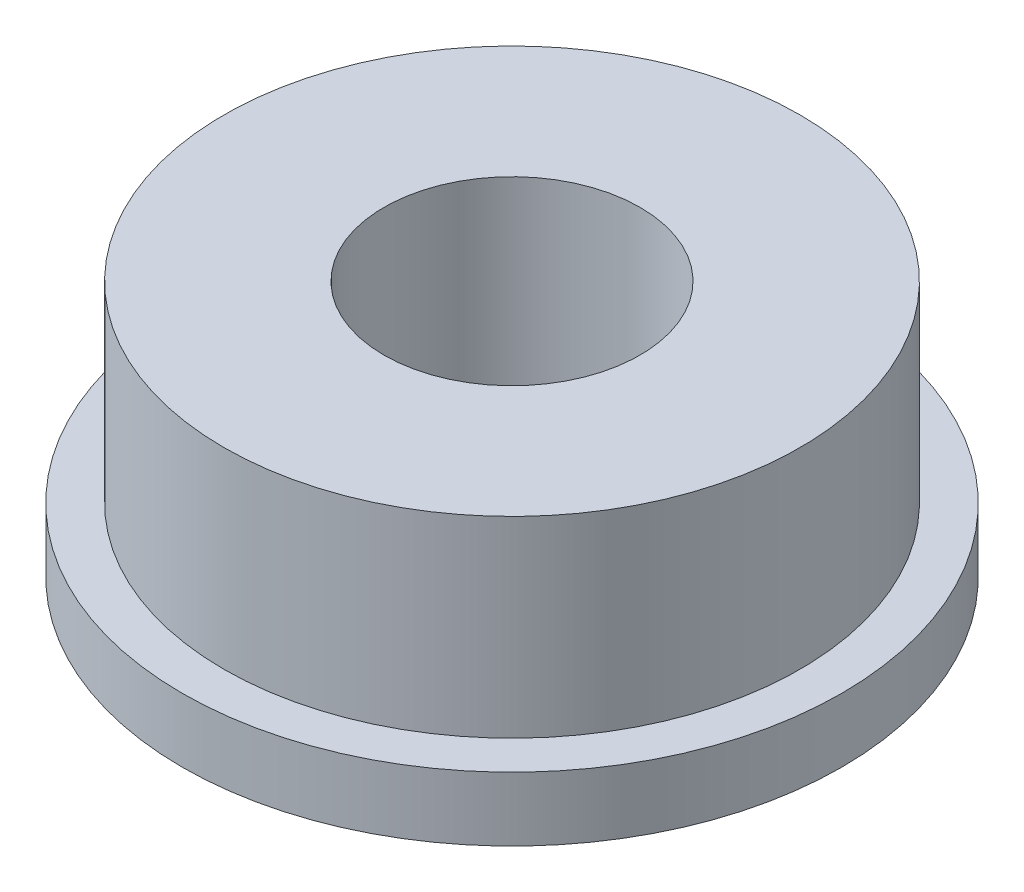
ISO-10303-21;
HEADER;
FILE_DESCRIPTION(('STEP AP214'),'2;1');
FILE_NAME('part.step','',(''),(''),'','','');
FILE_SCHEMA(('AUTOMOTIVE_DESIGN { 1 0 10303 214 1 1 1 1 }'));
ENDSEC;
DATA;
#1=APPLICATION_CONTEXT('core data for automotive mechanical design processes');
#2=APPLICATION_PROTOCOL_DEFINITION('international standard','automotive_design',2000,#1);
#3=PRODUCT_CONTEXT('',#1,'mechanical');
#4=PRODUCT('Part','Part','',(#3));
#5=PRODUCT_RELATED_PRODUCT_CATEGORY('part','',(#4));
#6=PRODUCT_DEFINITION_FORMATION('','',#4);
#7=PRODUCT_DEFINITION_CONTEXT('part definition',#1,'design');
#8=PRODUCT_DEFINITION('design','',#6,#7);
#9=PRODUCT_DEFINITION_SHAPE('','',#8);
#10=(LENGTH_UNIT() NAMED_UNIT(*) SI_UNIT(.MILLI.,.METRE.));
#11=(NAMED_UNIT(*) PLANE_ANGLE_UNIT() SI_UNIT($,.RADIAN.));
#12=(NAMED_UNIT(*) SI_UNIT($,.STERADIAN.) SOLID_ANGLE_UNIT());
#13=UNCERTAINTY_MEASURE_WITH_UNIT(LENGTH_MEASURE(1.E-05),#10,'distance_accuracy_value','');
#14=(GEOMETRIC_REPRESENTATION_CONTEXT(3) GLOBAL_UNCERTAINTY_ASSIGNED_CONTEXT((#13)) GLOBAL_UNIT_ASSIGNED_CONTEXT((#10,
#11,#12)) REPRESENTATION_CONTEXT('',''));
#15=CARTESIAN_POINT('',(0.,0.,0.));
#16=DIRECTION('',(0.,0.,1.));
#17=DIRECTION('',(1.,0.,0.));
#18=AXIS2_PLACEMENT_3D('',#15,#16,#17);
#19=CARTESIAN_POINT('',(0.,1.,0.));
#20=DIRECTION('',(0.,1.,0.));
#21=DIRECTION('',(0.,0.,-1.));
#22=AXIS2_PLACEMENT_3D('',#19,#20,#21);
#23=PLANE('',#22);
#24=CARTESIAN_POINT('',(0.,1.,0.));
#25=DIRECTION('',(0.,-1.,0.));
#26=DIRECTION('',(0.,0.,-1.));
#27=AXIS2_PLACEMENT_3D('',#24,#25,#26);
#28=CIRCLE('',#27,5.15);
#29=CARTESIAN_POINT('',(0.,1.,-5.15));
#30=VERTEX_POINT('',#29);
#31=EDGE_CURVE('E10',#30,#30,#28,.T.);
#32=ORIENTED_EDGE('',*,*,#31,.F.);
#33=EDGE_LOOP('',(#32));
#34=FACE_BOUND('',#33,.T.);
#35=CARTESIAN_POINT('',(0.,1.,0.));
#36=DIRECTION('',(0.,-1.,0.));
#37=DIRECTION('',(0.,0.,-1.));
#38=AXIS2_PLACEMENT_3D('',#35,#36,#37);
#39=CIRCLE('',#38,4.5);
#40=CARTESIAN_POINT('',(0.,1.,-4.5));
#41=VERTEX_POINT('',#40);
#42=EDGE_CURVE('E51',#41,#41,#39,.T.);
#43=ORIENTED_EDGE('',*,*,#42,.T.);
#44=EDGE_LOOP('',(#43));
#45=FACE_BOUND('',#44,.T.);
#46=ADVANCED_FACE('F35',(#34,#45),#23,.T.);
#47=CARTESIAN_POINT('',(0.,0.,0.));
#48=DIRECTION('',(0.,1.,0.));
#49=DIRECTION('',(0.,0.,-1.));
#50=AXIS2_PLACEMENT_3D('',#47,#48,#49);
#51=PLANE('',#50);
#52=CARTESIAN_POINT('',(0.,0.,0.));
#53=DIRECTION('',(0.,-1.,0.));
#54=DIRECTION('',(0.,0.,-1.));
#55=AXIS2_PLACEMENT_3D('',#52,#53,#54);
#56=CIRCLE('',#55,5.15);
#57=CARTESIAN_POINT('',(0.,0.,-5.15));
#58=VERTEX_POINT('',#57);
#59=EDGE_CURVE('E39',#58,#58,#56,.T.);
#60=ORIENTED_EDGE('',*,*,#59,.T.);
#61=EDGE_LOOP('',(#60));
#62=FACE_BOUND('',#61,.T.);
#63=CARTESIAN_POINT('',(0.,0.,0.));
#64=DIRECTION('',(0.,-1.,0.));
#65=DIRECTION('',(0.,0.,-1.));
#66=AXIS2_PLACEMENT_3D('',#63,#64,#65);
#67=CIRCLE('',#66,2.);
#68=CARTESIAN_POINT('',(0.,0.,-2.));
#69=VERTEX_POINT('',#68);
#70=EDGE_CURVE('E46',#69,#69,#67,.T.);
#71=ORIENTED_EDGE('',*,*,#70,.F.);
#72=EDGE_LOOP('',(#71));
#73=FACE_BOUND('',#72,.T.);
#74=ADVANCED_FACE('F73',(#62,#73),#51,.F.);
#75=CARTESIAN_POINT('',(0.,1.,0.));
#76=DIRECTION('',(0.,-1.,0.));
#77=DIRECTION('',(0.,0.,1.));
#78=AXIS2_PLACEMENT_3D('',#75,#76,#77);
#79=CYLINDRICAL_SURFACE('',#78,5.15);
#80=ORIENTED_EDGE('',*,*,#31,.T.);
#81=EDGE_LOOP('',(#80));
#82=FACE_BOUND('',#81,.T.);
#83=ORIENTED_EDGE('',*,*,#59,.F.);
#84=EDGE_LOOP('',(#83));
#85=FACE_BOUND('',#84,.T.);
#86=ADVANCED_FACE('F37',(#82,#85),#79,.T.);
#87=CARTESIAN_POINT('',(0.,1.,0.));
#88=DIRECTION('',(0.,-1.,0.));
#89=DIRECTION('',(0.,0.,1.));
#90=AXIS2_PLACEMENT_3D('',#87,#88,#89);
#91=CYLINDRICAL_SURFACE('',#90,2.);
#92=ORIENTED_EDGE('',*,*,#70,.T.);
#93=EDGE_LOOP('',(#92));
#94=FACE_BOUND('',#93,.T.);
#95=CARTESIAN_POINT('',(0.,4.,0.));
#96=DIRECTION('',(0.,-1.,0.));
#97=DIRECTION('',(0.,0.,-1.));
#98=AXIS2_PLACEMENT_3D('',#95,#96,#97);
#99=CIRCLE('',#98,2.);
#100=CARTESIAN_POINT('',(0.,4.,-2.));
#101=VERTEX_POINT('',#100);
#102=EDGE_CURVE('E54',#101,#101,#99,.T.);
#103=ORIENTED_EDGE('',*,*,#102,.F.);
#104=EDGE_LOOP('',(#103));
#105=FACE_BOUND('',#104,.T.);
#106=ADVANCED_FACE('F62',(#94,#105),#91,.F.);
#107=CARTESIAN_POINT('',(0.,4.,0.));
#108=DIRECTION('',(0.,1.,0.));
#109=DIRECTION('',(0.,0.,-1.));
#110=AXIS2_PLACEMENT_3D('',#107,#108,#109);
#111=PLANE('',#110);
#112=CARTESIAN_POINT('',(0.,4.,0.));
#113=DIRECTION('',(0.,-1.,0.));
#114=DIRECTION('',(0.,0.,-1.));
#115=AXIS2_PLACEMENT_3D('',#112,#113,#114);
#116=CIRCLE('',#115,4.5);
#117=CARTESIAN_POINT('',(0.,4.,-4.5));
#118=VERTEX_POINT('',#117);
#119=EDGE_CURVE('E50',#118,#118,#116,.T.);
#120=ORIENTED_EDGE('',*,*,#119,.F.);
#121=EDGE_LOOP('',(#120));
#122=FACE_BOUND('',#121,.T.);
#123=ORIENTED_EDGE('',*,*,#102,.T.);
#124=EDGE_LOOP('',(#123));
#125=FACE_BOUND('',#124,.T.);
#126=ADVANCED_FACE('F60',(#122,#125),#111,.T.);
#127=CARTESIAN_POINT('',(0.,4.,0.));
#128=DIRECTION('',(0.,-1.,0.));
#129=DIRECTION('',(0.,0.,1.));
#130=AXIS2_PLACEMENT_3D('',#127,#128,#129);
#131=CYLINDRICAL_SURFACE('',#130,4.5);
#132=ORIENTED_EDGE('',*,*,#119,.T.);
#133=EDGE_LOOP('',(#132));
#134=FACE_BOUND('',#133,.T.);
#135=ORIENTED_EDGE('',*,*,#42,.F.);
#136=EDGE_LOOP('',(#135));
#137=FACE_BOUND('',#136,.T.);
#138=ADVANCED_FACE('F70',(#134,#137),#131,.T.);
#139=CLOSED_SHELL('',(#46,#74,#86,#106,#126,#138));
#140=MANIFOLD_SOLID_BREP('B2',#139);
#141=ADVANCED_BREP_SHAPE_REPRESENTATION('',(#18,#140),#14);
#142=SHAPE_DEFINITION_REPRESENTATION(#9,#141);
ENDSEC;
END-ISO-10303-21;
